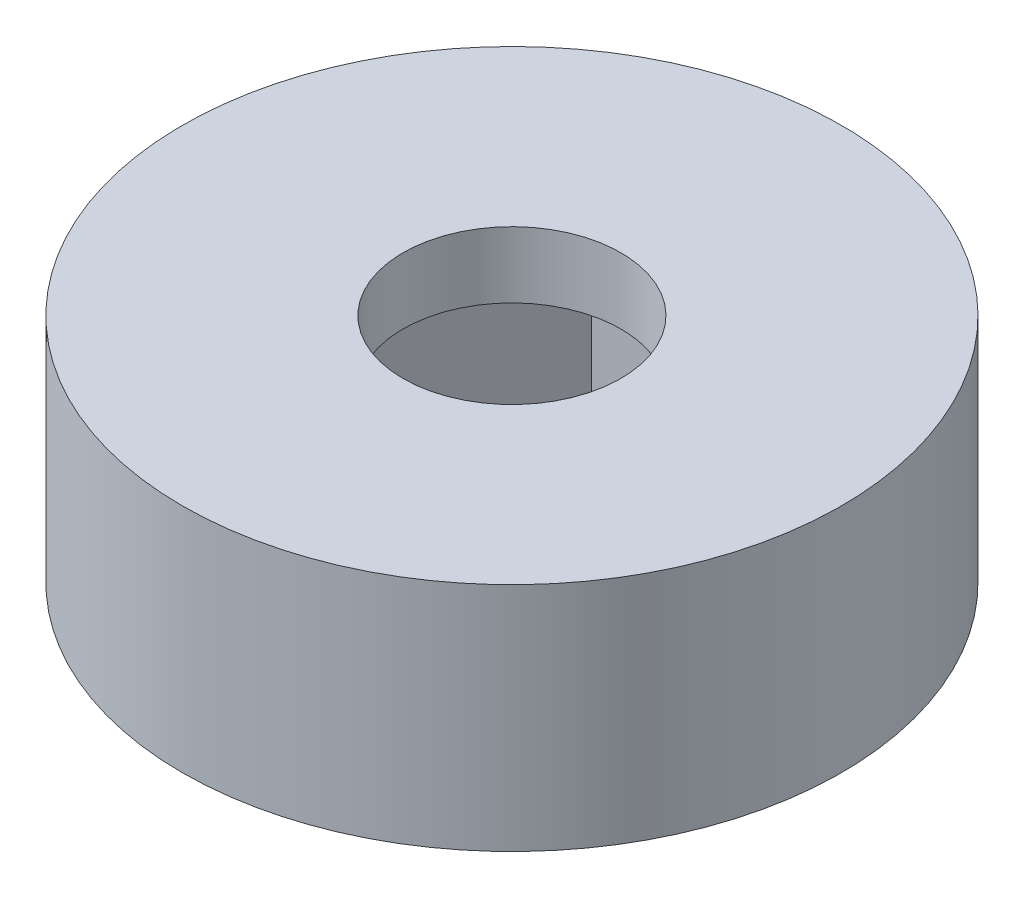
ISO-10303-21;
HEADER;
FILE_DESCRIPTION(('STEP AP214'),'2;1');
FILE_NAME('part.step','',(''),(''),'','','');
FILE_SCHEMA(('AUTOMOTIVE_DESIGN { 1 0 10303 214 1 1 1 1 }'));
ENDSEC;
DATA;
#1=APPLICATION_CONTEXT('core data for automotive mechanical design processes');
#2=APPLICATION_PROTOCOL_DEFINITION('international standard','automotive_design',2000,#1);
#3=PRODUCT_CONTEXT('',#1,'mechanical');
#4=PRODUCT('Part','Part','',(#3));
#5=PRODUCT_RELATED_PRODUCT_CATEGORY('part','',(#4));
#6=PRODUCT_DEFINITION_FORMATION('','',#4);
#7=PRODUCT_DEFINITION_CONTEXT('part definition',#1,'design');
#8=PRODUCT_DEFINITION('design','',#6,#7);
#9=PRODUCT_DEFINITION_SHAPE('','',#8);
#10=(LENGTH_UNIT() NAMED_UNIT(*) SI_UNIT(.MILLI.,.METRE.));
#11=(NAMED_UNIT(*) PLANE_ANGLE_UNIT() SI_UNIT($,.RADIAN.));
#12=(NAMED_UNIT(*) SI_UNIT($,.STERADIAN.) SOLID_ANGLE_UNIT());
#13=UNCERTAINTY_MEASURE_WITH_UNIT(LENGTH_MEASURE(1.E-05),#10,'distance_accuracy_value','');
#14=(GEOMETRIC_REPRESENTATION_CONTEXT(3) GLOBAL_UNCERTAINTY_ASSIGNED_CONTEXT((#13)) GLOBAL_UNIT_ASSIGNED_CONTEXT((#10,
#11,#12)) REPRESENTATION_CONTEXT('',''));
#15=CARTESIAN_POINT('',(0.,0.,0.));
#16=DIRECTION('',(0.,0.,1.));
#17=DIRECTION('',(1.,0.,0.));
#18=AXIS2_PLACEMENT_3D('',#15,#16,#17);
#19=CARTESIAN_POINT('',(0.,0.,0.));
#20=DIRECTION('',(0.,1.,0.));
#21=DIRECTION('',(0.,0.,1.));
#22=AXIS2_PLACEMENT_3D('',#19,#20,#21);
#23=PLANE('',#22);
#24=CARTESIAN_POINT('',(0.,0.,0.));
#25=DIRECTION('',(0.,1.,0.));
#26=DIRECTION('',(0.,0.,1.));
#27=AXIS2_PLACEMENT_3D('',#24,#25,#26);
#28=CIRCLE('',#27,4.99089653438087);
#29=CARTESIAN_POINT('',(0.,0.,4.99089653438087));
#30=VERTEX_POINT('',#29);
#31=EDGE_CURVE('E11',#30,#30,#28,.T.);
#32=ORIENTED_EDGE('',*,*,#31,.F.);
#33=EDGE_LOOP('',(#32));
#34=FACE_BOUND('',#33,.T.);
#35=DIRECTION('',(1.,0.,0.));
#36=VECTOR('',#35,1.);
#37=CARTESIAN_POINT('',(-1.64544826719043,0.,2.85));
#38=LINE('',#37,#36);
#39=CARTESIAN_POINT('',(-1.64544826719043,0.,2.85));
#40=VERTEX_POINT('',#39);
#41=CARTESIAN_POINT('',(1.64544826719043,0.,2.85));
#42=VERTEX_POINT('',#41);
#43=EDGE_CURVE('E50',#40,#42,#38,.T.);
#44=ORIENTED_EDGE('',*,*,#43,.T.);
#45=DIRECTION('',(0.5,0.,-0.866025403784439));
#46=VECTOR('',#45,1.);
#47=CARTESIAN_POINT('',(1.64544826719043,0.,2.85));
#48=LINE('',#47,#46);
#49=CARTESIAN_POINT('',(3.29089653438087,0.,0.));
#50=VERTEX_POINT('',#49);
#51=EDGE_CURVE('E106',#42,#50,#48,.T.);
#52=ORIENTED_EDGE('',*,*,#51,.T.);
#53=DIRECTION('',(-0.5,0.,-0.866025403784439));
#54=VECTOR('',#53,1.);
#55=CARTESIAN_POINT('',(3.29089653438087,0.,0.));
#56=LINE('',#55,#54);
#57=CARTESIAN_POINT('',(1.64544826719043,0.,-2.85));
#58=VERTEX_POINT('',#57);
#59=EDGE_CURVE('E104',#50,#58,#56,.T.);
#60=ORIENTED_EDGE('',*,*,#59,.T.);
#61=DIRECTION('',(-1.,0.,0.));
#62=VECTOR('',#61,1.);
#63=CARTESIAN_POINT('',(1.64544826719043,0.,-2.85));
#64=LINE('',#63,#62);
#65=CARTESIAN_POINT('',(-1.64544826719043,0.,-2.85));
#66=VERTEX_POINT('',#65);
#67=EDGE_CURVE('E85',#58,#66,#64,.T.);
#68=ORIENTED_EDGE('',*,*,#67,.T.);
#69=DIRECTION('',(-0.5,0.,0.866025403784439));
#70=VECTOR('',#69,1.);
#71=CARTESIAN_POINT('',(-1.64544826719043,0.,-2.85));
#72=LINE('',#71,#70);
#73=CARTESIAN_POINT('',(-3.29089653438086,0.,0.));
#74=VERTEX_POINT('',#73);
#75=EDGE_CURVE('E94',#66,#74,#72,.T.);
#76=ORIENTED_EDGE('',*,*,#75,.T.);
#77=DIRECTION('',(0.5,0.,0.866025403784439));
#78=VECTOR('',#77,1.);
#79=CARTESIAN_POINT('',(-3.29089653438086,0.,0.));
#80=LINE('',#79,#78);
#81=EDGE_CURVE('E100',#74,#40,#80,.T.);
#82=ORIENTED_EDGE('',*,*,#81,.T.);
#83=EDGE_LOOP('',(#44,#52,#60,#68,#76,#82));
#84=FACE_BOUND('',#83,.T.);
#85=ADVANCED_FACE('F35',(#34,#84),#23,.F.);
#86=CARTESIAN_POINT('',(0.,2.5,0.));
#87=DIRECTION('',(0.,-1.,0.));
#88=DIRECTION('',(0.,0.,-1.));
#89=AXIS2_PLACEMENT_3D('',#86,#87,#88);
#90=CYLINDRICAL_SURFACE('',#89,4.99089653438087);
#91=ORIENTED_EDGE('',*,*,#31,.T.);
#92=EDGE_LOOP('',(#91));
#93=FACE_BOUND('',#92,.T.);
#94=CARTESIAN_POINT('',(0.,3.5,0.));
#95=DIRECTION('',(0.,1.,0.));
#96=DIRECTION('',(0.,0.,1.));
#97=AXIS2_PLACEMENT_3D('',#94,#95,#96);
#98=CIRCLE('',#97,4.99089653438087);
#99=CARTESIAN_POINT('',(0.,3.5,4.99089653438087));
#100=VERTEX_POINT('',#99);
#101=EDGE_CURVE('E124',#100,#100,#98,.T.);
#102=ORIENTED_EDGE('',*,*,#101,.F.);
#103=EDGE_LOOP('',(#102));
#104=FACE_BOUND('',#103,.T.);
#105=ADVANCED_FACE('F37',(#93,#104),#90,.T.);
#106=CARTESIAN_POINT('',(-1.64544826719043,2.5,2.85));
#107=DIRECTION('',(0.,0.,-1.));
#108=DIRECTION('',(-1.,0.,0.));
#109=AXIS2_PLACEMENT_3D('',#106,#107,#108);
#110=PLANE('',#109);
#111=ORIENTED_EDGE('',*,*,#43,.F.);
#112=DIRECTION('',(0.,-1.,0.));
#113=VECTOR('',#112,1.);
#114=CARTESIAN_POINT('',(-1.64544826719043,2.5,2.85));
#115=LINE('',#114,#113);
#116=CARTESIAN_POINT('',(-1.64544826719043,2.5,2.85));
#117=VERTEX_POINT('',#116);
#118=EDGE_CURVE('E112',#117,#40,#115,.T.);
#119=ORIENTED_EDGE('',*,*,#118,.F.);
#120=DIRECTION('',(1.,0.,0.));
#121=VECTOR('',#120,1.);
#122=CARTESIAN_POINT('',(-1.64544826719043,2.5,2.85));
#123=LINE('',#122,#121);
#124=CARTESIAN_POINT('',(1.64544826719043,2.5,2.85));
#125=VERTEX_POINT('',#124);
#126=EDGE_CURVE('E111',#117,#125,#123,.T.);
#127=ORIENTED_EDGE('',*,*,#126,.T.);
#128=DIRECTION('',(0.,-1.,0.));
#129=VECTOR('',#128,1.);
#130=CARTESIAN_POINT('',(1.64544826719043,2.5,2.85));
#131=LINE('',#130,#129);
#132=EDGE_CURVE('E43',#125,#42,#131,.T.);
#133=ORIENTED_EDGE('',*,*,#132,.T.);
#134=EDGE_LOOP('',(#111,#119,#127,#133));
#135=FACE_BOUND('',#134,.T.);
#136=ADVANCED_FACE('F120',(#135),#110,.T.);
#137=CARTESIAN_POINT('',(1.64544826719043,2.5,2.85));
#138=DIRECTION('',(-0.866025403784439,0.,-0.5));
#139=DIRECTION('',(-0.5,0.,0.866025403784439));
#140=AXIS2_PLACEMENT_3D('',#137,#138,#139);
#141=PLANE('',#140);
#142=ORIENTED_EDGE('',*,*,#51,.F.);
#143=ORIENTED_EDGE('',*,*,#132,.F.);
#144=DIRECTION('',(0.5,0.,-0.866025403784439));
#145=VECTOR('',#144,1.);
#146=CARTESIAN_POINT('',(1.64544826719043,2.5,2.85));
#147=LINE('',#146,#145);
#148=CARTESIAN_POINT('',(3.29089653438087,2.5,0.));
#149=VERTEX_POINT('',#148);
#150=EDGE_CURVE('E137',#125,#149,#147,.T.);
#151=ORIENTED_EDGE('',*,*,#150,.T.);
#152=DIRECTION('',(0.,-1.,0.));
#153=VECTOR('',#152,1.);
#154=CARTESIAN_POINT('',(3.29089653438087,2.5,0.));
#155=LINE('',#154,#153);
#156=EDGE_CURVE('E117',#149,#50,#155,.T.);
#157=ORIENTED_EDGE('',*,*,#156,.T.);
#158=EDGE_LOOP('',(#142,#143,#151,#157));
#159=FACE_BOUND('',#158,.T.);
#160=ADVANCED_FACE('F173',(#159),#141,.T.);
#161=CARTESIAN_POINT('',(3.29089653438087,2.5,0.));
#162=DIRECTION('',(-0.866025403784439,0.,0.5));
#163=DIRECTION('',(0.5,0.,0.866025403784439));
#164=AXIS2_PLACEMENT_3D('',#161,#162,#163);
#165=PLANE('',#164);
#166=ORIENTED_EDGE('',*,*,#59,.F.);
#167=ORIENTED_EDGE('',*,*,#156,.F.);
#168=DIRECTION('',(-0.5,0.,-0.866025403784439));
#169=VECTOR('',#168,1.);
#170=CARTESIAN_POINT('',(3.29089653438087,2.5,0.));
#171=LINE('',#170,#169);
#172=CARTESIAN_POINT('',(1.64544826719043,2.5,-2.85));
#173=VERTEX_POINT('',#172);
#174=EDGE_CURVE('E135',#149,#173,#171,.T.);
#175=ORIENTED_EDGE('',*,*,#174,.T.);
#176=DIRECTION('',(0.,-1.,0.));
#177=VECTOR('',#176,1.);
#178=CARTESIAN_POINT('',(1.64544826719043,2.5,-2.85));
#179=LINE('',#178,#177);
#180=EDGE_CURVE('E90',#173,#58,#179,.T.);
#181=ORIENTED_EDGE('',*,*,#180,.T.);
#182=EDGE_LOOP('',(#166,#167,#175,#181));
#183=FACE_BOUND('',#182,.T.);
#184=ADVANCED_FACE('F176',(#183),#165,.T.);
#185=CARTESIAN_POINT('',(1.64544826719043,2.5,-2.85));
#186=DIRECTION('',(0.,0.,1.));
#187=DIRECTION('',(1.,0.,0.));
#188=AXIS2_PLACEMENT_3D('',#185,#186,#187);
#189=PLANE('',#188);
#190=ORIENTED_EDGE('',*,*,#67,.F.);
#191=ORIENTED_EDGE('',*,*,#180,.F.);
#192=DIRECTION('',(-1.,0.,0.));
#193=VECTOR('',#192,1.);
#194=CARTESIAN_POINT('',(1.64544826719043,2.5,-2.85));
#195=LINE('',#194,#193);
#196=CARTESIAN_POINT('',(-1.64544826719043,2.5,-2.85));
#197=VERTEX_POINT('',#196);
#198=EDGE_CURVE('E59',#173,#197,#195,.T.);
#199=ORIENTED_EDGE('',*,*,#198,.T.);
#200=DIRECTION('',(0.,-1.,0.));
#201=VECTOR('',#200,1.);
#202=CARTESIAN_POINT('',(-1.64544826719043,2.5,-2.85));
#203=LINE('',#202,#201);
#204=EDGE_CURVE('E80',#197,#66,#203,.T.);
#205=ORIENTED_EDGE('',*,*,#204,.T.);
#206=EDGE_LOOP('',(#190,#191,#199,#205));
#207=FACE_BOUND('',#206,.T.);
#208=ADVANCED_FACE('F82',(#207),#189,.T.);
#209=CARTESIAN_POINT('',(-1.64544826719043,2.5,-2.85));
#210=DIRECTION('',(0.866025403784439,0.,0.5));
#211=DIRECTION('',(0.5,0.,-0.866025403784439));
#212=AXIS2_PLACEMENT_3D('',#209,#210,#211);
#213=PLANE('',#212);
#214=ORIENTED_EDGE('',*,*,#75,.F.);
#215=ORIENTED_EDGE('',*,*,#204,.F.);
#216=DIRECTION('',(-0.5,0.,0.866025403784439));
#217=VECTOR('',#216,1.);
#218=CARTESIAN_POINT('',(-1.64544826719043,2.5,-2.85));
#219=LINE('',#218,#217);
#220=CARTESIAN_POINT('',(-3.29089653438086,2.5,0.));
#221=VERTEX_POINT('',#220);
#222=EDGE_CURVE('E132',#197,#221,#219,.T.);
#223=ORIENTED_EDGE('',*,*,#222,.T.);
#224=DIRECTION('',(0.,-1.,0.));
#225=VECTOR('',#224,1.);
#226=CARTESIAN_POINT('',(-3.29089653438086,2.5,0.));
#227=LINE('',#226,#225);
#228=EDGE_CURVE('E91',#221,#74,#227,.T.);
#229=ORIENTED_EDGE('',*,*,#228,.T.);
#230=EDGE_LOOP('',(#214,#215,#223,#229));
#231=FACE_BOUND('',#230,.T.);
#232=ADVANCED_FACE('F95',(#231),#213,.T.);
#233=CARTESIAN_POINT('',(-3.29089653438086,2.5,0.));
#234=DIRECTION('',(0.866025403784439,0.,-0.5));
#235=DIRECTION('',(-0.5,0.,-0.866025403784439));
#236=AXIS2_PLACEMENT_3D('',#233,#234,#235);
#237=PLANE('',#236);
#238=ORIENTED_EDGE('',*,*,#81,.F.);
#239=ORIENTED_EDGE('',*,*,#228,.F.);
#240=DIRECTION('',(0.5,0.,0.866025403784439));
#241=VECTOR('',#240,1.);
#242=CARTESIAN_POINT('',(-3.29089653438086,2.5,0.));
#243=LINE('',#242,#241);
#244=EDGE_CURVE('E114',#221,#117,#243,.T.);
#245=ORIENTED_EDGE('',*,*,#244,.T.);
#246=ORIENTED_EDGE('',*,*,#118,.T.);
#247=EDGE_LOOP('',(#238,#239,#245,#246));
#248=FACE_BOUND('',#247,.T.);
#249=ADVANCED_FACE('F152',(#248),#237,.T.);
#250=CARTESIAN_POINT('',(0.,3.5,0.));
#251=DIRECTION('',(0.,1.,0.));
#252=DIRECTION('',(0.,0.,1.));
#253=AXIS2_PLACEMENT_3D('',#250,#251,#252);
#254=PLANE('',#253);
#255=ORIENTED_EDGE('',*,*,#101,.T.);
#256=EDGE_LOOP('',(#255));
#257=FACE_BOUND('',#256,.T.);
#258=CARTESIAN_POINT('',(0.,3.5,0.));
#259=DIRECTION('',(0.,1.,0.));
#260=DIRECTION('',(0.,0.,1.));
#261=AXIS2_PLACEMENT_3D('',#258,#259,#260);
#262=CIRCLE('',#261,1.65);
#263=CARTESIAN_POINT('',(0.,3.5,1.65));
#264=VERTEX_POINT('',#263);
#265=EDGE_CURVE('E127',#264,#264,#262,.T.);
#266=ORIENTED_EDGE('',*,*,#265,.F.);
#267=EDGE_LOOP('',(#266));
#268=FACE_BOUND('',#267,.T.);
#269=ADVANCED_FACE('F149',(#257,#268),#254,.T.);
#270=CARTESIAN_POINT('',(0.,2.5,0.));
#271=DIRECTION('',(0.,1.,0.));
#272=DIRECTION('',(0.,0.,1.));
#273=AXIS2_PLACEMENT_3D('',#270,#271,#272);
#274=PLANE('',#273);
#275=ORIENTED_EDGE('',*,*,#150,.F.);
#276=ORIENTED_EDGE('',*,*,#126,.F.);
#277=ORIENTED_EDGE('',*,*,#244,.F.);
#278=ORIENTED_EDGE('',*,*,#222,.F.);
#279=ORIENTED_EDGE('',*,*,#198,.F.);
#280=ORIENTED_EDGE('',*,*,#174,.F.);
#281=EDGE_LOOP('',(#275,#276,#277,#278,#279,#280));
#282=FACE_BOUND('',#281,.T.);
#283=CARTESIAN_POINT('',(0.,2.5,0.));
#284=DIRECTION('',(0.,1.,0.));
#285=DIRECTION('',(0.,0.,1.));
#286=AXIS2_PLACEMENT_3D('',#283,#284,#285);
#287=CIRCLE('',#286,1.65);
#288=CARTESIAN_POINT('',(0.,2.5,1.65));
#289=VERTEX_POINT('',#288);
#290=EDGE_CURVE('E140',#289,#289,#287,.T.);
#291=ORIENTED_EDGE('',*,*,#290,.T.);
#292=EDGE_LOOP('',(#291));
#293=FACE_BOUND('',#292,.T.);
#294=ADVANCED_FACE('F151',(#282,#293),#274,.F.);
#295=CARTESIAN_POINT('',(0.,3.5,0.));
#296=DIRECTION('',(0.,-1.,0.));
#297=DIRECTION('',(0.,0.,-1.));
#298=AXIS2_PLACEMENT_3D('',#295,#296,#297);
#299=CYLINDRICAL_SURFACE('',#298,1.65);
#300=ORIENTED_EDGE('',*,*,#265,.T.);
#301=EDGE_LOOP('',(#300));
#302=FACE_BOUND('',#301,.T.);
#303=ORIENTED_EDGE('',*,*,#290,.F.);
#304=EDGE_LOOP('',(#303));
#305=FACE_BOUND('',#304,.T.);
#306=ADVANCED_FACE('F146',(#302,#305),#299,.F.);
#307=CLOSED_SHELL('',(#85,#105,#136,#160,#184,#208,#232,#249,#269,#294,#306));
#308=MANIFOLD_SOLID_BREP('B2',#307);
#309=ADVANCED_BREP_SHAPE_REPRESENTATION('',(#18,#308),#14);
#310=SHAPE_DEFINITION_REPRESENTATION(#9,#309);
ENDSEC;
END-ISO-10303-21;
